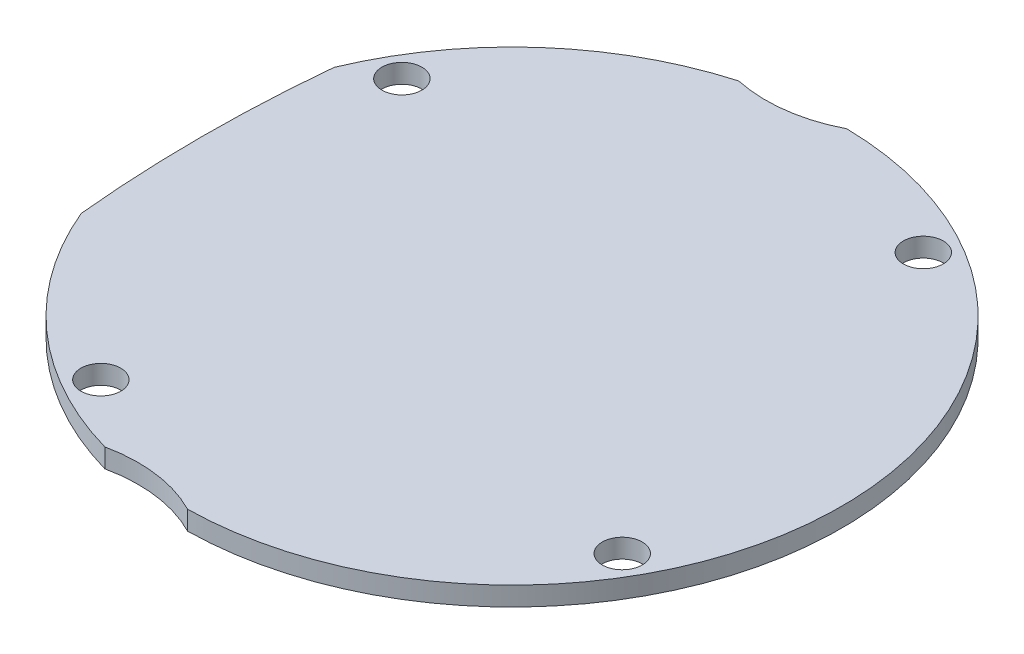
ISO-10303-21;
HEADER;
FILE_DESCRIPTION(('STEP AP214'),'2;1');
FILE_NAME('part.step','',(''),(''),'','','');
FILE_SCHEMA(('AUTOMOTIVE_DESIGN { 1 0 10303 214 1 1 1 1 }'));
ENDSEC;
DATA;
#1=APPLICATION_CONTEXT('core data for automotive mechanical design processes');
#2=APPLICATION_PROTOCOL_DEFINITION('international standard','automotive_design',2000,#1);
#3=PRODUCT_CONTEXT('',#1,'mechanical');
#4=PRODUCT('Part','Part','',(#3));
#5=PRODUCT_RELATED_PRODUCT_CATEGORY('part','',(#4));
#6=PRODUCT_DEFINITION_FORMATION('','',#4);
#7=PRODUCT_DEFINITION_CONTEXT('part definition',#1,'design');
#8=PRODUCT_DEFINITION('design','',#6,#7);
#9=PRODUCT_DEFINITION_SHAPE('','',#8);
#10=(LENGTH_UNIT() NAMED_UNIT(*) SI_UNIT(.MILLI.,.METRE.));
#11=(NAMED_UNIT(*) PLANE_ANGLE_UNIT() SI_UNIT($,.RADIAN.));
#12=(NAMED_UNIT(*) SI_UNIT($,.STERADIAN.) SOLID_ANGLE_UNIT());
#13=UNCERTAINTY_MEASURE_WITH_UNIT(LENGTH_MEASURE(1.E-05),#10,'distance_accuracy_value','');
#14=(GEOMETRIC_REPRESENTATION_CONTEXT(3) GLOBAL_UNCERTAINTY_ASSIGNED_CONTEXT((#13)) GLOBAL_UNIT_ASSIGNED_CONTEXT((#10,
#11,#12)) REPRESENTATION_CONTEXT('',''));
#15=CARTESIAN_POINT('',(0.,0.,0.));
#16=DIRECTION('',(0.,0.,1.));
#17=DIRECTION('',(1.,0.,0.));
#18=AXIS2_PLACEMENT_3D('',#15,#16,#17);
#19=CARTESIAN_POINT('',(155.,3.,0.));
#20=DIRECTION('',(0.,1.,0.));
#21=DIRECTION('',(0.,0.,1.));
#22=AXIS2_PLACEMENT_3D('',#19,#20,#21);
#23=CYLINDRICAL_SURFACE('',#22,204.);
#24=CARTESIAN_POINT('',(155.,0.,0.));
#25=DIRECTION('',(0.,1.,0.));
#26=DIRECTION('',(-0.995208728652752,0.,-0.0977731374835253));
#27=AXIS2_PLACEMENT_3D('',#24,#25,#26);
#28=CIRCLE('',#27,204.);
#29=CARTESIAN_POINT('',(-48.02258064516,0.,-19.94572004664));
#30=VERTEX_POINT('',#29);
#31=CARTESIAN_POINT('',(-48.02258064516,0.,19.94572004664));
#32=VERTEX_POINT('',#31);
#33=EDGE_CURVE('E21',#30,#32,#28,.T.);
#34=ORIENTED_EDGE('',*,*,#33,.T.);
#35=DIRECTION('',(0.,-1.,0.));
#36=VECTOR('',#35,1.);
#37=CARTESIAN_POINT('',(-48.02258064516,3.,19.94572004664));
#38=LINE('',#37,#36);
#39=CARTESIAN_POINT('',(-48.02258064516,3.,19.94572004664));
#40=VERTEX_POINT('',#39);
#41=EDGE_CURVE('E123',#40,#32,#38,.T.);
#42=ORIENTED_EDGE('',*,*,#41,.F.);
#43=CARTESIAN_POINT('',(155.,3.,0.));
#44=DIRECTION('',(0.,1.,0.));
#45=DIRECTION('',(-0.995208728652752,0.,-0.0977731374835253));
#46=AXIS2_PLACEMENT_3D('',#43,#44,#45);
#47=CIRCLE('',#46,204.);
#48=CARTESIAN_POINT('',(-48.02258064516,3.,-19.94572004664));
#49=VERTEX_POINT('',#48);
#50=EDGE_CURVE('E140',#49,#40,#47,.T.);
#51=ORIENTED_EDGE('',*,*,#50,.F.);
#52=DIRECTION('',(0.,-1.,0.));
#53=VECTOR('',#52,1.);
#54=CARTESIAN_POINT('',(-48.02258064516,3.,-19.94572004664));
#55=LINE('',#54,#53);
#56=EDGE_CURVE('E11',#49,#30,#55,.T.);
#57=ORIENTED_EDGE('',*,*,#56,.T.);
#58=EDGE_LOOP('',(#34,#42,#51,#57));
#59=FACE_BOUND('',#58,.T.);
#60=ADVANCED_FACE('F17',(#59),#23,.T.);
#61=CARTESIAN_POINT('',(-9.5,3.,72.));
#62=DIRECTION('',(0.,1.,0.));
#63=DIRECTION('',(0.13081069392508,0.,-0.991407364484872));
#64=AXIS2_PLACEMENT_3D('',#61,#62,#63);
#65=CYLINDRICAL_SURFACE('',#64,22.5);
#66=CARTESIAN_POINT('',(-9.5,0.,72.));
#67=DIRECTION('',(0.,1.,0.));
#68=DIRECTION('',(0.457597137162491,0.,-0.889159636994782));
#69=AXIS2_PLACEMENT_3D('',#66,#67,#68);
#70=CIRCLE('',#69,22.5);
#71=CARTESIAN_POINT('',(0.7959355861571,0.,51.99390816762));
#72=VERTEX_POINT('',#71);
#73=CARTESIAN_POINT('',(-14.25453159507,0.,50.00808263676));
#74=VERTEX_POINT('',#73);
#75=EDGE_CURVE('E114',#72,#74,#70,.T.);
#76=ORIENTED_EDGE('',*,*,#75,.F.);
#77=DIRECTION('',(0.,-1.,0.));
#78=VECTOR('',#77,1.);
#79=CARTESIAN_POINT('',(0.7959355861571,3.,51.99390816762));
#80=LINE('',#79,#78);
#81=CARTESIAN_POINT('',(0.7959355861571,3.,51.99390816762));
#82=VERTEX_POINT('',#81);
#83=EDGE_CURVE('E28',#82,#72,#80,.T.);
#84=ORIENTED_EDGE('',*,*,#83,.F.);
#85=CARTESIAN_POINT('',(-9.5,3.,72.));
#86=DIRECTION('',(0.,-1.,0.));
#87=DIRECTION('',(-0.211312515336389,0.,-0.977418549477248));
#88=AXIS2_PLACEMENT_3D('',#85,#86,#87);
#89=CIRCLE('',#88,22.5);
#90=CARTESIAN_POINT('',(-14.25453159507,3.,50.00808263676));
#91=VERTEX_POINT('',#90);
#92=EDGE_CURVE('E139',#91,#82,#89,.T.);
#93=ORIENTED_EDGE('',*,*,#92,.F.);
#94=DIRECTION('',(0.,-1.,0.));
#95=VECTOR('',#94,1.);
#96=CARTESIAN_POINT('',(-14.25453159507,3.,50.00808263676));
#97=LINE('',#96,#95);
#98=EDGE_CURVE('E91',#91,#74,#97,.T.);
#99=ORIENTED_EDGE('',*,*,#98,.T.);
#100=EDGE_LOOP('',(#76,#84,#93,#99));
#101=FACE_BOUND('',#100,.T.);
#102=ADVANCED_FACE('F241',(#101),#65,.F.);
#103=CARTESIAN_POINT('',(0.,3.15,0.));
#104=DIRECTION('',(0.,-1.,0.));
#105=DIRECTION('',(-1.,0.,0.));
#106=AXIS2_PLACEMENT_3D('',#103,#104,#105);
#107=CYLINDRICAL_SURFACE('',#106,52.);
#108=DIRECTION('',(0.,-1.,0.));
#109=VECTOR('',#108,1.);
#110=CARTESIAN_POINT('',(-14.25453159507,3.,-50.00808263676));
#111=LINE('',#110,#109);
#112=CARTESIAN_POINT('',(-14.25453159507,3.,-50.00808263676));
#113=VERTEX_POINT('',#112);
#114=CARTESIAN_POINT('',(-14.25453159507,0.,-50.00808263676));
#115=VERTEX_POINT('',#114);
#116=EDGE_CURVE('E77',#113,#115,#111,.T.);
#117=ORIENTED_EDGE('',*,*,#116,.T.);
#118=CARTESIAN_POINT('',(0.,0.,0.));
#119=DIRECTION('',(0.,-1.,0.));
#120=DIRECTION('',(-0.923511166253095,0.,-0.383571539358498));
#121=AXIS2_PLACEMENT_3D('',#118,#119,#120);
#122=CIRCLE('',#121,52.);
#123=EDGE_CURVE('E82',#30,#115,#122,.T.);
#124=ORIENTED_EDGE('',*,*,#123,.F.);
#125=ORIENTED_EDGE('',*,*,#56,.F.);
#126=CARTESIAN_POINT('',(0.,3.,0.));
#127=DIRECTION('',(0.,1.,0.));
#128=DIRECTION('',(-0.274125607597499,0.,-0.961693896860795));
#129=AXIS2_PLACEMENT_3D('',#126,#127,#128);
#130=CIRCLE('',#129,52.);
#131=EDGE_CURVE('E85',#113,#49,#130,.T.);
#132=ORIENTED_EDGE('',*,*,#131,.F.);
#133=EDGE_LOOP('',(#117,#124,#125,#132));
#134=FACE_BOUND('',#133,.T.);
#135=ADVANCED_FACE('F79',(#134),#107,.T.);
#136=CARTESIAN_POINT('',(0.,3.15,0.));
#137=DIRECTION('',(0.,-1.,0.));
#138=DIRECTION('',(1.,0.,0.));
#139=AXIS2_PLACEMENT_3D('',#136,#137,#138);
#140=CYLINDRICAL_SURFACE('',#139,52.);
#141=DIRECTION('',(0.,-1.,0.));
#142=VECTOR('',#141,1.);
#143=CARTESIAN_POINT('',(0.7959355861572,3.,-51.99390816762));
#144=LINE('',#143,#142);
#145=CARTESIAN_POINT('',(0.7959355861572,3.,-51.99390816762));
#146=VERTEX_POINT('',#145);
#147=CARTESIAN_POINT('',(0.7959355861572,0.,-51.99390816762));
#148=VERTEX_POINT('',#147);
#149=EDGE_CURVE('E92',#146,#148,#144,.T.);
#150=ORIENTED_EDGE('',*,*,#149,.F.);
#151=CARTESIAN_POINT('',(0.,3.,0.));
#152=DIRECTION('',(0.,1.,0.));
#153=DIRECTION('',(0.0153064535799395,0.,0.999882849377268));
#154=AXIS2_PLACEMENT_3D('',#151,#152,#153);
#155=CIRCLE('',#154,52.);
#156=EDGE_CURVE('E165',#82,#146,#155,.T.);
#157=ORIENTED_EDGE('',*,*,#156,.F.);
#158=ORIENTED_EDGE('',*,*,#83,.T.);
#159=CARTESIAN_POINT('',(0.,0.,0.));
#160=DIRECTION('',(0.,-1.,0.));
#161=DIRECTION('',(0.0153064535799495,0.,-0.999882849377268));
#162=AXIS2_PLACEMENT_3D('',#159,#160,#161);
#163=CIRCLE('',#162,52.);
#164=EDGE_CURVE('E108',#148,#72,#163,.T.);
#165=ORIENTED_EDGE('',*,*,#164,.F.);
#166=EDGE_LOOP('',(#150,#157,#158,#165));
#167=FACE_BOUND('',#166,.T.);
#168=ADVANCED_FACE('F255',(#167),#140,.T.);
#169=CARTESIAN_POINT('',(0.,3.15,0.));
#170=DIRECTION('',(0.,-1.,0.));
#171=DIRECTION('',(-1.,0.,0.));
#172=AXIS2_PLACEMENT_3D('',#169,#170,#171);
#173=CYLINDRICAL_SURFACE('',#172,52.);
#174=ORIENTED_EDGE('',*,*,#98,.F.);
#175=CARTESIAN_POINT('',(0.,3.,0.));
#176=DIRECTION('',(0.,1.,0.));
#177=DIRECTION('',(-0.923511166253095,0.,0.383571539358498));
#178=AXIS2_PLACEMENT_3D('',#175,#176,#177);
#179=CIRCLE('',#178,52.);
#180=EDGE_CURVE('E135',#40,#91,#179,.T.);
#181=ORIENTED_EDGE('',*,*,#180,.F.);
#182=ORIENTED_EDGE('',*,*,#41,.T.);
#183=CARTESIAN_POINT('',(0.,0.,0.));
#184=DIRECTION('',(0.,-1.,0.));
#185=DIRECTION('',(-0.274125607597499,0.,0.961693896860795));
#186=AXIS2_PLACEMENT_3D('',#183,#184,#185);
#187=CIRCLE('',#186,52.);
#188=EDGE_CURVE('E118',#74,#32,#187,.T.);
#189=ORIENTED_EDGE('',*,*,#188,.F.);
#190=EDGE_LOOP('',(#174,#181,#182,#189));
#191=FACE_BOUND('',#190,.T.);
#192=ADVANCED_FACE('F253',(#191),#173,.T.);
#193=CARTESIAN_POINT('',(-9.5,3.,-72.));
#194=DIRECTION('',(0.,-1.,0.));
#195=DIRECTION('',(0.130810693925082,0.,0.991407364484871));
#196=AXIS2_PLACEMENT_3D('',#193,#194,#195);
#197=CYLINDRICAL_SURFACE('',#196,22.5);
#198=CARTESIAN_POINT('',(-9.5,3.,-72.));
#199=DIRECTION('',(0.,-1.,0.));
#200=DIRECTION('',(0.457597137162491,0.,0.889159636994782));
#201=AXIS2_PLACEMENT_3D('',#198,#199,#200);
#202=CIRCLE('',#201,22.5);
#203=EDGE_CURVE('E159',#146,#113,#202,.T.);
#204=ORIENTED_EDGE('',*,*,#203,.F.);
#205=ORIENTED_EDGE('',*,*,#149,.T.);
#206=CARTESIAN_POINT('',(-9.5,0.,-72.));
#207=DIRECTION('',(0.,1.,0.));
#208=DIRECTION('',(-0.211312515336389,0.,0.977418549477248));
#209=AXIS2_PLACEMENT_3D('',#206,#207,#208);
#210=CIRCLE('',#209,22.5);
#211=EDGE_CURVE('E98',#115,#148,#210,.T.);
#212=ORIENTED_EDGE('',*,*,#211,.F.);
#213=ORIENTED_EDGE('',*,*,#116,.F.);
#214=EDGE_LOOP('',(#204,#205,#212,#213));
#215=FACE_BOUND('',#214,.T.);
#216=ADVANCED_FACE('F104',(#215),#197,.F.);
#217=CARTESIAN_POINT('',(23.75,3.,-41.13620667976));
#218=DIRECTION('',(0.,-1.,0.));
#219=DIRECTION('',(1.,0.,0.));
#220=AXIS2_PLACEMENT_3D('',#217,#218,#219);
#221=CYLINDRICAL_SURFACE('',#220,3.15);
#222=CARTESIAN_POINT('',(23.75,3.,-41.13620667976));
#223=DIRECTION('',(0.,-1.,0.));
#224=DIRECTION('',(1.,0.,0.));
#225=AXIS2_PLACEMENT_3D('',#222,#223,#224);
#226=CIRCLE('',#225,3.15);
#227=CARTESIAN_POINT('',(20.6,3.,-41.13620667976));
#228=VERTEX_POINT('',#227);
#229=EDGE_CURVE('E133',#228,#228,#226,.T.);
#230=ORIENTED_EDGE('',*,*,#229,.F.);
#231=DIRECTION('',(0.,-1.,0.));
#232=VECTOR('',#231,1.);
#233=CARTESIAN_POINT('',(20.6,3.,-41.13620667976));
#234=LINE('',#233,#232);
#235=CARTESIAN_POINT('',(20.6,0.,-41.13620667976));
#236=VERTEX_POINT('',#235);
#237=EDGE_CURVE('E42',#228,#236,#234,.T.);
#238=ORIENTED_EDGE('',*,*,#237,.T.);
#239=CARTESIAN_POINT('',(23.75,0.,-41.13620667976));
#240=DIRECTION('',(0.,-1.,0.));
#241=DIRECTION('',(1.,0.,0.));
#242=AXIS2_PLACEMENT_3D('',#239,#240,#241);
#243=CIRCLE('',#242,3.15);
#244=EDGE_CURVE('E124',#236,#236,#243,.T.);
#245=ORIENTED_EDGE('',*,*,#244,.T.);
#246=ORIENTED_EDGE('',*,*,#237,.F.);
#247=EDGE_LOOP('',(#230,#238,#245,#246));
#248=FACE_BOUND('',#247,.T.);
#249=ADVANCED_FACE('F250',(#248),#221,.F.);
#250=CARTESIAN_POINT('',(-41.13620667976,3.,-23.75));
#251=DIRECTION('',(0.,-1.,0.));
#252=DIRECTION('',(1.,0.,0.));
#253=AXIS2_PLACEMENT_3D('',#250,#251,#252);
#254=CYLINDRICAL_SURFACE('',#253,3.15);
#255=CARTESIAN_POINT('',(-41.13620667976,3.,-23.75));
#256=DIRECTION('',(0.,-1.,0.));
#257=DIRECTION('',(1.,0.,0.));
#258=AXIS2_PLACEMENT_3D('',#255,#256,#257);
#259=CIRCLE('',#258,3.15);
#260=CARTESIAN_POINT('',(-44.28620667976,3.,-23.75));
#261=VERTEX_POINT('',#260);
#262=EDGE_CURVE('E129',#261,#261,#259,.T.);
#263=ORIENTED_EDGE('',*,*,#262,.F.);
#264=DIRECTION('',(0.,-1.,0.));
#265=VECTOR('',#264,1.);
#266=CARTESIAN_POINT('',(-44.28620667976,3.,-23.75));
#267=LINE('',#266,#265);
#268=CARTESIAN_POINT('',(-44.28620667976,0.,-23.75));
#269=VERTEX_POINT('',#268);
#270=EDGE_CURVE('E142',#261,#269,#267,.T.);
#271=ORIENTED_EDGE('',*,*,#270,.T.);
#272=CARTESIAN_POINT('',(-41.13620667976,0.,-23.75));
#273=DIRECTION('',(0.,-1.,0.));
#274=DIRECTION('',(1.,0.,0.));
#275=AXIS2_PLACEMENT_3D('',#272,#273,#274);
#276=CIRCLE('',#275,3.15);
#277=EDGE_CURVE('E128',#269,#269,#276,.T.);
#278=ORIENTED_EDGE('',*,*,#277,.T.);
#279=ORIENTED_EDGE('',*,*,#270,.F.);
#280=EDGE_LOOP('',(#263,#271,#278,#279));
#281=FACE_BOUND('',#280,.T.);
#282=ADVANCED_FACE('F19',(#281),#254,.F.);
#283=CARTESIAN_POINT('',(-23.75,3.,41.13620667976));
#284=DIRECTION('',(0.,-1.,0.));
#285=DIRECTION('',(1.,0.,0.));
#286=AXIS2_PLACEMENT_3D('',#283,#284,#285);
#287=CYLINDRICAL_SURFACE('',#286,3.15);
#288=CARTESIAN_POINT('',(-23.75,3.,41.13620667976));
#289=DIRECTION('',(0.,-1.,0.));
#290=DIRECTION('',(1.,0.,0.));
#291=AXIS2_PLACEMENT_3D('',#288,#289,#290);
#292=CIRCLE('',#291,3.15);
#293=CARTESIAN_POINT('',(-26.9,3.,41.13620667976));
#294=VERTEX_POINT('',#293);
#295=EDGE_CURVE('E134',#294,#294,#292,.T.);
#296=ORIENTED_EDGE('',*,*,#295,.F.);
#297=DIRECTION('',(0.,-1.,0.));
#298=VECTOR('',#297,1.);
#299=CARTESIAN_POINT('',(-26.9,3.,41.13620667976));
#300=LINE('',#299,#298);
#301=CARTESIAN_POINT('',(-26.9,0.,41.13620667976));
#302=VERTEX_POINT('',#301);
#303=EDGE_CURVE('E155',#294,#302,#300,.T.);
#304=ORIENTED_EDGE('',*,*,#303,.T.);
#305=CARTESIAN_POINT('',(-23.75,0.,41.13620667976));
#306=DIRECTION('',(0.,-1.,0.));
#307=DIRECTION('',(1.,0.,0.));
#308=AXIS2_PLACEMENT_3D('',#305,#306,#307);
#309=CIRCLE('',#308,3.15);
#310=EDGE_CURVE('E102',#302,#302,#309,.T.);
#311=ORIENTED_EDGE('',*,*,#310,.T.);
#312=ORIENTED_EDGE('',*,*,#303,.F.);
#313=EDGE_LOOP('',(#296,#304,#311,#312));
#314=FACE_BOUND('',#313,.T.);
#315=ADVANCED_FACE('F222',(#314),#287,.F.);
#316=CARTESIAN_POINT('',(0.,3.,0.));
#317=DIRECTION('',(0.,-1.,0.));
#318=DIRECTION('',(0.,0.,-1.));
#319=AXIS2_PLACEMENT_3D('',#316,#317,#318);
#320=PLANE('',#319);
#321=CARTESIAN_POINT('',(41.13620667976,3.,23.75));
#322=DIRECTION('',(0.,-1.,0.));
#323=DIRECTION('',(1.,0.,0.));
#324=AXIS2_PLACEMENT_3D('',#321,#322,#323);
#325=CIRCLE('',#324,3.15);
#326=CARTESIAN_POINT('',(37.98620667976,3.,23.75));
#327=VERTEX_POINT('',#326);
#328=EDGE_CURVE('E147',#327,#327,#325,.T.);
#329=ORIENTED_EDGE('',*,*,#328,.T.);
#330=EDGE_LOOP('',(#329));
#331=FACE_BOUND('',#330,.T.);
#332=ORIENTED_EDGE('',*,*,#229,.T.);
#333=EDGE_LOOP('',(#332));
#334=FACE_BOUND('',#333,.T.);
#335=ORIENTED_EDGE('',*,*,#262,.T.);
#336=EDGE_LOOP('',(#335));
#337=FACE_BOUND('',#336,.T.);
#338=ORIENTED_EDGE('',*,*,#295,.T.);
#339=EDGE_LOOP('',(#338));
#340=FACE_BOUND('',#339,.T.);
#341=ORIENTED_EDGE('',*,*,#203,.T.);
#342=ORIENTED_EDGE('',*,*,#131,.T.);
#343=ORIENTED_EDGE('',*,*,#50,.T.);
#344=ORIENTED_EDGE('',*,*,#180,.T.);
#345=ORIENTED_EDGE('',*,*,#92,.T.);
#346=ORIENTED_EDGE('',*,*,#156,.T.);
#347=EDGE_LOOP('',(#341,#342,#343,#344,#345,#346));
#348=FACE_BOUND('',#347,.T.);
#349=ADVANCED_FACE('F199',(#331,#334,#337,#340,#348),#320,.F.);
#350=CARTESIAN_POINT('',(41.13620667976,3.,23.75));
#351=DIRECTION('',(0.,-1.,0.));
#352=DIRECTION('',(1.,0.,0.));
#353=AXIS2_PLACEMENT_3D('',#350,#351,#352);
#354=CYLINDRICAL_SURFACE('',#353,3.15);
#355=ORIENTED_EDGE('',*,*,#328,.F.);
#356=DIRECTION('',(0.,-1.,0.));
#357=VECTOR('',#356,1.);
#358=CARTESIAN_POINT('',(37.98620667976,3.,23.75));
#359=LINE('',#358,#357);
#360=CARTESIAN_POINT('',(37.98620667976,0.,23.75));
#361=VERTEX_POINT('',#360);
#362=EDGE_CURVE('E151',#327,#361,#359,.T.);
#363=ORIENTED_EDGE('',*,*,#362,.T.);
#364=CARTESIAN_POINT('',(41.13620667976,0.,23.75));
#365=DIRECTION('',(0.,-1.,0.));
#366=DIRECTION('',(1.,0.,0.));
#367=AXIS2_PLACEMENT_3D('',#364,#365,#366);
#368=CIRCLE('',#367,3.15);
#369=EDGE_CURVE('E127',#361,#361,#368,.T.);
#370=ORIENTED_EDGE('',*,*,#369,.T.);
#371=ORIENTED_EDGE('',*,*,#362,.F.);
#372=EDGE_LOOP('',(#355,#363,#370,#371));
#373=FACE_BOUND('',#372,.T.);
#374=ADVANCED_FACE('F227',(#373),#354,.F.);
#375=CARTESIAN_POINT('',(0.,0.,0.));
#376=DIRECTION('',(0.,-1.,0.));
#377=DIRECTION('',(0.,0.,-1.));
#378=AXIS2_PLACEMENT_3D('',#375,#376,#377);
#379=PLANE('',#378);
#380=ORIENTED_EDGE('',*,*,#369,.F.);
#381=EDGE_LOOP('',(#380));
#382=FACE_BOUND('',#381,.T.);
#383=ORIENTED_EDGE('',*,*,#244,.F.);
#384=EDGE_LOOP('',(#383));
#385=FACE_BOUND('',#384,.T.);
#386=ORIENTED_EDGE('',*,*,#277,.F.);
#387=EDGE_LOOP('',(#386));
#388=FACE_BOUND('',#387,.T.);
#389=ORIENTED_EDGE('',*,*,#310,.F.);
#390=EDGE_LOOP('',(#389));
#391=FACE_BOUND('',#390,.T.);
#392=ORIENTED_EDGE('',*,*,#211,.T.);
#393=ORIENTED_EDGE('',*,*,#164,.T.);
#394=ORIENTED_EDGE('',*,*,#75,.T.);
#395=ORIENTED_EDGE('',*,*,#188,.T.);
#396=ORIENTED_EDGE('',*,*,#33,.F.);
#397=ORIENTED_EDGE('',*,*,#123,.T.);
#398=EDGE_LOOP('',(#392,#393,#394,#395,#396,#397));
#399=FACE_BOUND('',#398,.T.);
#400=ADVANCED_FACE('F96',(#382,#385,#388,#391,#399),#379,.T.);
#401=CLOSED_SHELL('',(#60,#102,#135,#168,#192,#216,#249,#282,#315,#349,#374,#400));
#402=MANIFOLD_SOLID_BREP('B1',#401);
#403=ADVANCED_BREP_SHAPE_REPRESENTATION('',(#18,#402),#14);
#404=SHAPE_DEFINITION_REPRESENTATION(#9,#403);
ENDSEC;
END-ISO-10303-21;
